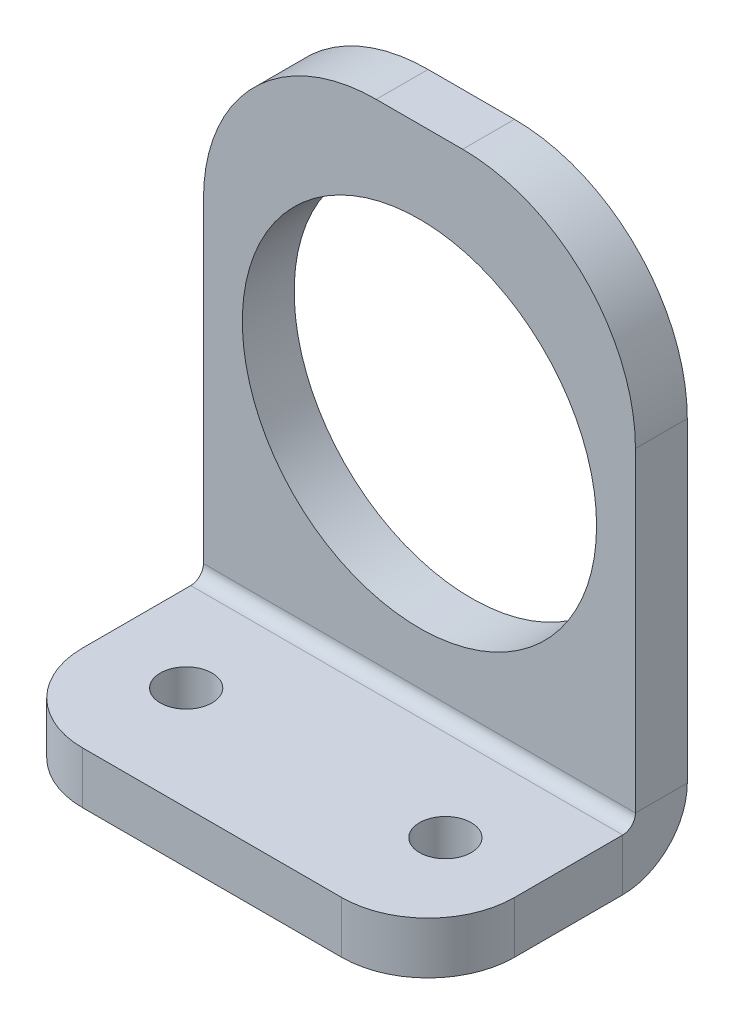
ISO-10303-21;
HEADER;
FILE_DESCRIPTION(('STEP AP214'),'2;1');
FILE_NAME('part.step','',(''),(''),'','','');
FILE_SCHEMA(('AUTOMOTIVE_DESIGN { 1 0 10303 214 1 1 1 1 }'));
ENDSEC;
DATA;
#1=APPLICATION_CONTEXT('core data for automotive mechanical design processes');
#2=APPLICATION_PROTOCOL_DEFINITION('international standard','automotive_design',2000,#1);
#3=PRODUCT_CONTEXT('',#1,'mechanical');
#4=PRODUCT('Part','Part','',(#3));
#5=PRODUCT_RELATED_PRODUCT_CATEGORY('part','',(#4));
#6=PRODUCT_DEFINITION_FORMATION('','',#4);
#7=PRODUCT_DEFINITION_CONTEXT('part definition',#1,'design');
#8=PRODUCT_DEFINITION('design','',#6,#7);
#9=PRODUCT_DEFINITION_SHAPE('','',#8);
#10=(LENGTH_UNIT() NAMED_UNIT(*) SI_UNIT(.MILLI.,.METRE.));
#11=(NAMED_UNIT(*) PLANE_ANGLE_UNIT() SI_UNIT($,.RADIAN.));
#12=(NAMED_UNIT(*) SI_UNIT($,.STERADIAN.) SOLID_ANGLE_UNIT());
#13=UNCERTAINTY_MEASURE_WITH_UNIT(LENGTH_MEASURE(1.E-05),#10,'distance_accuracy_value','');
#14=(GEOMETRIC_REPRESENTATION_CONTEXT(3) GLOBAL_UNCERTAINTY_ASSIGNED_CONTEXT((#13)) GLOBAL_UNIT_ASSIGNED_CONTEXT((#10,
#11,#12)) REPRESENTATION_CONTEXT('',''));
#15=CARTESIAN_POINT('',(0.,0.,0.));
#16=DIRECTION('',(0.,0.,1.));
#17=DIRECTION('',(1.,0.,0.));
#18=AXIS2_PLACEMENT_3D('',#15,#16,#17);
#19=CARTESIAN_POINT('',(12.5,-16.,-3.));
#20=DIRECTION('',(1.,0.,0.));
#21=DIRECTION('',(0.,0.,-1.));
#22=AXIS2_PLACEMENT_3D('',#19,#20,#21);
#23=PLANE('',#22);
#24=DIRECTION('',(0.,1.,0.));
#25=VECTOR('',#24,1.);
#26=CARTESIAN_POINT('',(12.5,-16.,-3.));
#27=LINE('',#26,#25);
#28=CARTESIAN_POINT('',(12.5,-12.2634,-3.));
#29=VERTEX_POINT('',#28);
#30=CARTESIAN_POINT('',(12.5,5.99999999999999,-3.));
#31=VERTEX_POINT('',#30);
#32=EDGE_CURVE('E220',#29,#31,#27,.T.);
#33=ORIENTED_EDGE('',*,*,#32,.T.);
#34=DIRECTION('',(0.,0.,1.));
#35=VECTOR('',#34,1.);
#36=CARTESIAN_POINT('',(12.5,5.99999999999999,-3.));
#37=LINE('',#36,#35);
#38=CARTESIAN_POINT('',(12.5,5.99999999999999,0.));
#39=VERTEX_POINT('',#38);
#40=EDGE_CURVE('E227',#31,#39,#37,.T.);
#41=ORIENTED_EDGE('',*,*,#40,.T.);
#42=DIRECTION('',(0.,1.,0.));
#43=VECTOR('',#42,1.);
#44=CARTESIAN_POINT('',(12.5,-16.,0.));
#45=LINE('',#44,#43);
#46=CARTESIAN_POINT('',(12.5,-12.2634,0.));
#47=VERTEX_POINT('',#46);
#48=EDGE_CURVE('E229',#47,#39,#45,.T.);
#49=ORIENTED_EDGE('',*,*,#48,.F.);
#50=DIRECTION('',(0.,0.,-1.));
#51=VECTOR('',#50,1.);
#52=CARTESIAN_POINT('',(12.5,-12.2634,0.));
#53=LINE('',#52,#51);
#54=EDGE_CURVE('E204',#47,#29,#53,.T.);
#55=ORIENTED_EDGE('',*,*,#54,.T.);
#56=EDGE_LOOP('',(#33,#41,#49,#55));
#57=FACE_BOUND('',#56,.T.);
#58=ADVANCED_FACE('F63',(#57),#23,.T.);
#59=CARTESIAN_POINT('',(0.,0.,-3.));
#60=DIRECTION('',(0.,0.,1.));
#61=DIRECTION('',(1.,0.,0.));
#62=AXIS2_PLACEMENT_3D('',#59,#60,#61);
#63=PLANE('',#62);
#64=CARTESIAN_POINT('',(0.,0.999999999999949,-3.));
#65=DIRECTION('',(0.,0.,1.));
#66=DIRECTION('',(1.,0.,0.));
#67=AXIS2_PLACEMENT_3D('',#64,#65,#66);
#68=CIRCLE('',#67,10.25);
#69=CARTESIAN_POINT('',(10.25,0.999999999999949,-3.));
#70=VERTEX_POINT('',#69);
#71=EDGE_CURVE('E201',#70,#70,#68,.T.);
#72=ORIENTED_EDGE('',*,*,#71,.T.);
#73=EDGE_LOOP('',(#72));
#74=FACE_BOUND('',#73,.T.);
#75=DIRECTION('',(-1.,0.,0.));
#76=VECTOR('',#75,1.);
#77=CARTESIAN_POINT('',(12.5,16.,-3.));
#78=LINE('',#77,#76);
#79=CARTESIAN_POINT('',(2.5,16.,-3.));
#80=VERTEX_POINT('',#79);
#81=CARTESIAN_POINT('',(-2.5,16.,-3.));
#82=VERTEX_POINT('',#81);
#83=EDGE_CURVE('E224',#80,#82,#78,.T.);
#84=ORIENTED_EDGE('',*,*,#83,.F.);
#85=CARTESIAN_POINT('',(2.5,5.99999999999999,-3.));
#86=DIRECTION('',(0.,0.,1.));
#87=DIRECTION('',(1.,0.,0.));
#88=AXIS2_PLACEMENT_3D('',#85,#86,#87);
#89=CIRCLE('',#88,10.);
#90=EDGE_CURVE('E247',#80,#31,#89,.F.);
#91=ORIENTED_EDGE('',*,*,#90,.T.);
#92=ORIENTED_EDGE('',*,*,#32,.F.);
#93=DIRECTION('',(1.,0.,0.));
#94=VECTOR('',#93,1.);
#95=CARTESIAN_POINT('',(12.5,-12.2634,-3.));
#96=LINE('',#95,#94);
#97=CARTESIAN_POINT('',(-12.5,-12.2634,-3.));
#98=VERTEX_POINT('',#97);
#99=EDGE_CURVE('E164',#29,#98,#96,.F.);
#100=ORIENTED_EDGE('',*,*,#99,.T.);
#101=DIRECTION('',(0.,-1.,0.));
#102=VECTOR('',#101,1.);
#103=CARTESIAN_POINT('',(-12.5,-16.,-3.));
#104=LINE('',#103,#102);
#105=CARTESIAN_POINT('',(-12.5,5.99999999999999,-3.));
#106=VERTEX_POINT('',#105);
#107=EDGE_CURVE('E218',#106,#98,#104,.T.);
#108=ORIENTED_EDGE('',*,*,#107,.F.);
#109=CARTESIAN_POINT('',(-2.5,5.99999999999999,-3.));
#110=DIRECTION('',(0.,0.,1.));
#111=DIRECTION('',(1.,0.,0.));
#112=AXIS2_PLACEMENT_3D('',#109,#110,#111);
#113=CIRCLE('',#112,10.);
#114=EDGE_CURVE('E245',#106,#82,#113,.F.);
#115=ORIENTED_EDGE('',*,*,#114,.T.);
#116=EDGE_LOOP('',(#84,#91,#92,#100,#108,#115));
#117=FACE_BOUND('',#116,.T.);
#118=ADVANCED_FACE('F292',(#74,#117),#63,.F.);
#119=CARTESIAN_POINT('',(0.,0.,0.));
#120=DIRECTION('',(0.,0.,1.));
#121=DIRECTION('',(1.,0.,0.));
#122=AXIS2_PLACEMENT_3D('',#119,#120,#121);
#123=PLANE('',#122);
#124=CARTESIAN_POINT('',(0.,0.999999999999949,0.));
#125=DIRECTION('',(0.,0.,1.));
#126=DIRECTION('',(1.,0.,0.));
#127=AXIS2_PLACEMENT_3D('',#124,#125,#126);
#128=CIRCLE('',#127,10.25);
#129=CARTESIAN_POINT('',(10.25,0.999999999999949,0.));
#130=VERTEX_POINT('',#129);
#131=EDGE_CURVE('E379',#130,#130,#128,.T.);
#132=ORIENTED_EDGE('',*,*,#131,.F.);
#133=EDGE_LOOP('',(#132));
#134=FACE_BOUND('',#133,.T.);
#135=ORIENTED_EDGE('',*,*,#48,.T.);
#136=CARTESIAN_POINT('',(2.5,5.99999999999999,0.));
#137=DIRECTION('',(0.,0.,1.));
#138=DIRECTION('',(1.,0.,0.));
#139=AXIS2_PLACEMENT_3D('',#136,#137,#138);
#140=CIRCLE('',#139,10.);
#141=CARTESIAN_POINT('',(2.5,16.,0.));
#142=VERTEX_POINT('',#141);
#143=EDGE_CURVE('E238',#39,#142,#140,.T.);
#144=ORIENTED_EDGE('',*,*,#143,.T.);
#145=DIRECTION('',(-1.,0.,0.));
#146=VECTOR('',#145,1.);
#147=CARTESIAN_POINT('',(12.5,16.,0.));
#148=LINE('',#147,#146);
#149=CARTESIAN_POINT('',(-2.5,16.,0.));
#150=VERTEX_POINT('',#149);
#151=EDGE_CURVE('E221',#142,#150,#148,.T.);
#152=ORIENTED_EDGE('',*,*,#151,.T.);
#153=CARTESIAN_POINT('',(-2.5,5.99999999999999,0.));
#154=DIRECTION('',(0.,0.,1.));
#155=DIRECTION('',(1.,0.,0.));
#156=AXIS2_PLACEMENT_3D('',#153,#154,#155);
#157=CIRCLE('',#156,10.);
#158=CARTESIAN_POINT('',(-12.5,5.99999999999999,0.));
#159=VERTEX_POINT('',#158);
#160=EDGE_CURVE('E236',#150,#159,#157,.T.);
#161=ORIENTED_EDGE('',*,*,#160,.T.);
#162=DIRECTION('',(0.,-1.,0.));
#163=VECTOR('',#162,1.);
#164=CARTESIAN_POINT('',(-12.5,-16.,0.));
#165=LINE('',#164,#163);
#166=CARTESIAN_POINT('',(-12.5,-12.2634,0.));
#167=VERTEX_POINT('',#166);
#168=EDGE_CURVE('E215',#159,#167,#165,.T.);
#169=ORIENTED_EDGE('',*,*,#168,.T.);
#170=DIRECTION('',(1.,0.,0.));
#171=VECTOR('',#170,1.);
#172=CARTESIAN_POINT('',(12.5,-12.2634,0.));
#173=LINE('',#172,#171);
#174=EDGE_CURVE('E208',#47,#167,#173,.F.);
#175=ORIENTED_EDGE('',*,*,#174,.F.);
#176=EDGE_LOOP('',(#135,#144,#152,#161,#169,#175));
#177=FACE_BOUND('',#176,.T.);
#178=ADVANCED_FACE('F298',(#134,#177),#123,.T.);
#179=CARTESIAN_POINT('',(-12.5,-16.,-3.));
#180=DIRECTION('',(-1.,0.,0.));
#181=DIRECTION('',(0.,0.,1.));
#182=AXIS2_PLACEMENT_3D('',#179,#180,#181);
#183=PLANE('',#182);
#184=ORIENTED_EDGE('',*,*,#168,.F.);
#185=DIRECTION('',(0.,0.,1.));
#186=VECTOR('',#185,1.);
#187=CARTESIAN_POINT('',(-12.5,5.99999999999999,-3.));
#188=LINE('',#187,#186);
#189=EDGE_CURVE('E249',#159,#106,#188,.F.);
#190=ORIENTED_EDGE('',*,*,#189,.T.);
#191=ORIENTED_EDGE('',*,*,#107,.T.);
#192=DIRECTION('',(0.,0.,-1.));
#193=VECTOR('',#192,1.);
#194=CARTESIAN_POINT('',(-12.5,-12.2634,0.));
#195=LINE('',#194,#193);
#196=EDGE_CURVE('E212',#167,#98,#195,.T.);
#197=ORIENTED_EDGE('',*,*,#196,.F.);
#198=EDGE_LOOP('',(#184,#190,#191,#197));
#199=FACE_BOUND('',#198,.T.);
#200=ADVANCED_FACE('F286',(#199),#183,.T.);
#201=CARTESIAN_POINT('',(12.5,16.,-3.));
#202=DIRECTION('',(0.,1.,0.));
#203=DIRECTION('',(0.,0.,1.));
#204=AXIS2_PLACEMENT_3D('',#201,#202,#203);
#205=PLANE('',#204);
#206=ORIENTED_EDGE('',*,*,#151,.F.);
#207=DIRECTION('',(0.,0.,1.));
#208=VECTOR('',#207,1.);
#209=CARTESIAN_POINT('',(2.5,16.,-3.));
#210=LINE('',#209,#208);
#211=EDGE_CURVE('E243',#142,#80,#210,.F.);
#212=ORIENTED_EDGE('',*,*,#211,.T.);
#213=ORIENTED_EDGE('',*,*,#83,.T.);
#214=DIRECTION('',(0.,0.,1.));
#215=VECTOR('',#214,1.);
#216=CARTESIAN_POINT('',(-2.5,16.,-3.));
#217=LINE('',#216,#215);
#218=EDGE_CURVE('E240',#82,#150,#217,.T.);
#219=ORIENTED_EDGE('',*,*,#218,.T.);
#220=EDGE_LOOP('',(#206,#212,#213,#219));
#221=FACE_BOUND('',#220,.T.);
#222=ADVANCED_FACE('F304',(#221),#205,.T.);
#223=CARTESIAN_POINT('',(-12.5,-12.2634,0.7366));
#224=DIRECTION('',(-1.,0.,0.));
#225=DIRECTION('',(0.,0.,1.));
#226=AXIS2_PLACEMENT_3D('',#223,#224,#225);
#227=PLANE('',#226);
#228=DIRECTION('',(0.,1.,0.));
#229=VECTOR('',#228,1.);
#230=CARTESIAN_POINT('',(-12.5,-16.,0.736599999999986));
#231=LINE('',#230,#229);
#232=CARTESIAN_POINT('',(-12.5,-13.,0.736599999999997));
#233=VERTEX_POINT('',#232);
#234=CARTESIAN_POINT('',(-12.5,-16.,0.736599999999986));
#235=VERTEX_POINT('',#234);
#236=EDGE_CURVE('E198',#233,#235,#231,.F.);
#237=ORIENTED_EDGE('',*,*,#236,.F.);
#238=CARTESIAN_POINT('',(-12.5,-12.2634,0.7366));
#239=DIRECTION('',(1.,0.,0.));
#240=DIRECTION('',(0.,0.,-1.));
#241=AXIS2_PLACEMENT_3D('',#238,#239,#240);
#242=CIRCLE('',#241,0.7366);
#243=EDGE_CURVE('E167',#167,#233,#242,.F.);
#244=ORIENTED_EDGE('',*,*,#243,.F.);
#245=ORIENTED_EDGE('',*,*,#196,.T.);
#246=CARTESIAN_POINT('',(-12.5,-12.2634,0.7366));
#247=DIRECTION('',(1.,0.,0.));
#248=DIRECTION('',(0.,0.,-1.));
#249=AXIS2_PLACEMENT_3D('',#246,#247,#248);
#250=CIRCLE('',#249,3.7366);
#251=EDGE_CURVE('E203',#98,#235,#250,.F.);
#252=ORIENTED_EDGE('',*,*,#251,.T.);
#253=EDGE_LOOP('',(#237,#244,#245,#252));
#254=FACE_BOUND('',#253,.T.);
#255=ADVANCED_FACE('F282',(#254),#227,.T.);
#256=CARTESIAN_POINT('',(12.5,-12.2634,0.7366));
#257=DIRECTION('',(-1.,0.,0.));
#258=DIRECTION('',(0.,0.,1.));
#259=AXIS2_PLACEMENT_3D('',#256,#257,#258);
#260=PLANE('',#259);
#261=CARTESIAN_POINT('',(12.5,-12.2634,0.7366));
#262=DIRECTION('',(1.,0.,0.));
#263=DIRECTION('',(0.,0.,-1.));
#264=AXIS2_PLACEMENT_3D('',#261,#262,#263);
#265=CIRCLE('',#264,0.7366);
#266=CARTESIAN_POINT('',(12.5,-13.,0.736599999999997));
#267=VERTEX_POINT('',#266);
#268=EDGE_CURVE('E174',#267,#47,#265,.T.);
#269=ORIENTED_EDGE('',*,*,#268,.F.);
#270=DIRECTION('',(0.,1.,0.));
#271=VECTOR('',#270,1.);
#272=CARTESIAN_POINT('',(12.5,-13.,0.736599999999997));
#273=LINE('',#272,#271);
#274=CARTESIAN_POINT('',(12.5,-16.,0.736599999999986));
#275=VERTEX_POINT('',#274);
#276=EDGE_CURVE('E171',#267,#275,#273,.F.);
#277=ORIENTED_EDGE('',*,*,#276,.T.);
#278=CARTESIAN_POINT('',(12.5,-12.2634,0.7366));
#279=DIRECTION('',(1.,0.,0.));
#280=DIRECTION('',(0.,0.,-1.));
#281=AXIS2_PLACEMENT_3D('',#278,#279,#280);
#282=CIRCLE('',#281,3.7366);
#283=EDGE_CURVE('E156',#275,#29,#282,.T.);
#284=ORIENTED_EDGE('',*,*,#283,.T.);
#285=ORIENTED_EDGE('',*,*,#54,.F.);
#286=EDGE_LOOP('',(#269,#277,#284,#285));
#287=FACE_BOUND('',#286,.T.);
#288=ADVANCED_FACE('F172',(#287),#260,.F.);
#289=CARTESIAN_POINT('',(12.5,-12.2634,0.7366));
#290=DIRECTION('',(1.,0.,0.));
#291=DIRECTION('',(0.,-1.,0.));
#292=AXIS2_PLACEMENT_3D('',#289,#290,#291);
#293=CYLINDRICAL_SURFACE('',#292,3.7366);
#294=ORIENTED_EDGE('',*,*,#99,.F.);
#295=ORIENTED_EDGE('',*,*,#283,.F.);
#296=DIRECTION('',(1.,0.,0.));
#297=VECTOR('',#296,1.);
#298=CARTESIAN_POINT('',(-12.5,-16.,0.736599999999986));
#299=LINE('',#298,#297);
#300=EDGE_CURVE('E161',#275,#235,#299,.F.);
#301=ORIENTED_EDGE('',*,*,#300,.T.);
#302=ORIENTED_EDGE('',*,*,#251,.F.);
#303=EDGE_LOOP('',(#294,#295,#301,#302));
#304=FACE_BOUND('',#303,.T.);
#305=ADVANCED_FACE('F158',(#304),#293,.T.);
#306=CARTESIAN_POINT('',(12.5,-12.2634,0.7366));
#307=DIRECTION('',(1.,0.,0.));
#308=DIRECTION('',(0.,-1.,0.));
#309=AXIS2_PLACEMENT_3D('',#306,#307,#308);
#310=CYLINDRICAL_SURFACE('',#309,0.7366);
#311=ORIENTED_EDGE('',*,*,#174,.T.);
#312=ORIENTED_EDGE('',*,*,#243,.T.);
#313=DIRECTION('',(1.,0.,0.));
#314=VECTOR('',#313,1.);
#315=CARTESIAN_POINT('',(-12.5,-13.,0.736599999999997));
#316=LINE('',#315,#314);
#317=EDGE_CURVE('E176',#233,#267,#316,.T.);
#318=ORIENTED_EDGE('',*,*,#317,.T.);
#319=ORIENTED_EDGE('',*,*,#268,.T.);
#320=EDGE_LOOP('',(#311,#312,#318,#319));
#321=FACE_BOUND('',#320,.T.);
#322=ADVANCED_FACE('F279',(#321),#310,.F.);
#323=CARTESIAN_POINT('',(-12.5,-16.,0.));
#324=DIRECTION('',(1.,0.,0.));
#325=DIRECTION('',(0.,0.,-1.));
#326=AXIS2_PLACEMENT_3D('',#323,#324,#325);
#327=PLANE('',#326);
#328=DIRECTION('',(0.,0.,-1.));
#329=VECTOR('',#328,1.);
#330=CARTESIAN_POINT('',(-12.5,-16.,0.));
#331=LINE('',#330,#329);
#332=CARTESIAN_POINT('',(-12.5,-16.,7.));
#333=VERTEX_POINT('',#332);
#334=EDGE_CURVE('E181',#333,#235,#331,.T.);
#335=ORIENTED_EDGE('',*,*,#334,.F.);
#336=DIRECTION('',(0.,1.,0.));
#337=VECTOR('',#336,1.);
#338=CARTESIAN_POINT('',(-12.5,-16.,7.));
#339=LINE('',#338,#337);
#340=CARTESIAN_POINT('',(-12.5,-13.,7.00000000000001));
#341=VERTEX_POINT('',#340);
#342=EDGE_CURVE('E13',#333,#341,#339,.T.);
#343=ORIENTED_EDGE('',*,*,#342,.T.);
#344=DIRECTION('',(0.,0.,1.));
#345=VECTOR('',#344,1.);
#346=CARTESIAN_POINT('',(-12.5,-13.,0.));
#347=LINE('',#346,#345);
#348=EDGE_CURVE('E182',#341,#233,#347,.F.);
#349=ORIENTED_EDGE('',*,*,#348,.T.);
#350=ORIENTED_EDGE('',*,*,#236,.T.);
#351=EDGE_LOOP('',(#335,#343,#349,#350));
#352=FACE_BOUND('',#351,.T.);
#353=ADVANCED_FACE('F276',(#352),#327,.F.);
#354=CARTESIAN_POINT('',(12.5,-16.,12.));
#355=DIRECTION('',(-1.,0.,0.));
#356=DIRECTION('',(0.,0.,1.));
#357=AXIS2_PLACEMENT_3D('',#354,#355,#356);
#358=PLANE('',#357);
#359=DIRECTION('',(0.,0.,-1.));
#360=VECTOR('',#359,1.);
#361=CARTESIAN_POINT('',(12.5,-13.,12.));
#362=LINE('',#361,#360);
#363=CARTESIAN_POINT('',(12.5,-13.,7.00000000000001));
#364=VERTEX_POINT('',#363);
#365=EDGE_CURVE('E194',#267,#364,#362,.F.);
#366=ORIENTED_EDGE('',*,*,#365,.T.);
#367=DIRECTION('',(0.,1.,0.));
#368=VECTOR('',#367,1.);
#369=CARTESIAN_POINT('',(12.5,-16.,7.));
#370=LINE('',#369,#368);
#371=CARTESIAN_POINT('',(12.5,-16.,7.));
#372=VERTEX_POINT('',#371);
#373=EDGE_CURVE('E86',#364,#372,#370,.F.);
#374=ORIENTED_EDGE('',*,*,#373,.T.);
#375=DIRECTION('',(0.,0.,1.));
#376=VECTOR('',#375,1.);
#377=CARTESIAN_POINT('',(12.5,-16.,0.));
#378=LINE('',#377,#376);
#379=EDGE_CURVE('E179',#275,#372,#378,.T.);
#380=ORIENTED_EDGE('',*,*,#379,.F.);
#381=ORIENTED_EDGE('',*,*,#276,.F.);
#382=EDGE_LOOP('',(#366,#374,#380,#381));
#383=FACE_BOUND('',#382,.T.);
#384=ADVANCED_FACE('F184',(#383),#358,.F.);
#385=CARTESIAN_POINT('',(0.,-16.,0.));
#386=DIRECTION('',(0.,1.,0.));
#387=DIRECTION('',(0.,0.,1.));
#388=AXIS2_PLACEMENT_3D('',#385,#386,#387);
#389=PLANE('',#388);
#390=CARTESIAN_POINT('',(-7.5,-16.,6.));
#391=DIRECTION('',(0.,1.,0.));
#392=DIRECTION('',(0.,0.,1.));
#393=AXIS2_PLACEMENT_3D('',#390,#391,#392);
#394=CIRCLE('',#393,1.5);
#395=CARTESIAN_POINT('',(-7.5,-16.,7.5));
#396=VERTEX_POINT('',#395);
#397=EDGE_CURVE('E375',#396,#396,#394,.T.);
#398=ORIENTED_EDGE('',*,*,#397,.T.);
#399=EDGE_LOOP('',(#398));
#400=FACE_BOUND('',#399,.T.);
#401=CARTESIAN_POINT('',(7.5,-16.,6.));
#402=DIRECTION('',(0.,1.,0.));
#403=DIRECTION('',(0.,0.,1.));
#404=AXIS2_PLACEMENT_3D('',#401,#402,#403);
#405=CIRCLE('',#404,1.5);
#406=CARTESIAN_POINT('',(7.5,-16.,7.5));
#407=VERTEX_POINT('',#406);
#408=EDGE_CURVE('E373',#407,#407,#405,.T.);
#409=ORIENTED_EDGE('',*,*,#408,.T.);
#410=EDGE_LOOP('',(#409));
#411=FACE_BOUND('',#410,.T.);
#412=ORIENTED_EDGE('',*,*,#379,.T.);
#413=CARTESIAN_POINT('',(7.5,-16.,7.));
#414=DIRECTION('',(0.,1.,0.));
#415=DIRECTION('',(0.,0.,1.));
#416=AXIS2_PLACEMENT_3D('',#413,#414,#415);
#417=CIRCLE('',#416,5.);
#418=CARTESIAN_POINT('',(7.5,-16.,12.));
#419=VERTEX_POINT('',#418);
#420=EDGE_CURVE('E71',#372,#419,#417,.F.);
#421=ORIENTED_EDGE('',*,*,#420,.T.);
#422=DIRECTION('',(-1.,0.,0.));
#423=VECTOR('',#422,1.);
#424=CARTESIAN_POINT('',(0.,-16.,12.));
#425=LINE('',#424,#423);
#426=CARTESIAN_POINT('',(-7.5,-16.,12.));
#427=VERTEX_POINT('',#426);
#428=EDGE_CURVE('E185',#419,#427,#425,.T.);
#429=ORIENTED_EDGE('',*,*,#428,.T.);
#430=CARTESIAN_POINT('',(-7.5,-16.,7.));
#431=DIRECTION('',(0.,1.,0.));
#432=DIRECTION('',(0.,0.,1.));
#433=AXIS2_PLACEMENT_3D('',#430,#431,#432);
#434=CIRCLE('',#433,5.);
#435=EDGE_CURVE('E78',#427,#333,#434,.F.);
#436=ORIENTED_EDGE('',*,*,#435,.T.);
#437=ORIENTED_EDGE('',*,*,#334,.T.);
#438=ORIENTED_EDGE('',*,*,#300,.F.);
#439=EDGE_LOOP('',(#412,#421,#429,#436,#437,#438));
#440=FACE_BOUND('',#439,.T.);
#441=ADVANCED_FACE('F178',(#400,#411,#440),#389,.F.);
#442=CARTESIAN_POINT('',(0.,-13.,0.));
#443=DIRECTION('',(0.,1.,0.));
#444=DIRECTION('',(0.,0.,1.));
#445=AXIS2_PLACEMENT_3D('',#442,#443,#444);
#446=PLANE('',#445);
#447=CARTESIAN_POINT('',(-7.5,-13.,6.00000000000001));
#448=DIRECTION('',(0.,1.,0.));
#449=DIRECTION('',(0.,0.,1.));
#450=AXIS2_PLACEMENT_3D('',#447,#448,#449);
#451=CIRCLE('',#450,1.5);
#452=CARTESIAN_POINT('',(-7.5,-13.,7.50000000000001));
#453=VERTEX_POINT('',#452);
#454=EDGE_CURVE('E376',#453,#453,#451,.T.);
#455=ORIENTED_EDGE('',*,*,#454,.F.);
#456=EDGE_LOOP('',(#455));
#457=FACE_BOUND('',#456,.T.);
#458=CARTESIAN_POINT('',(7.5,-13.,6.00000000000001));
#459=DIRECTION('',(0.,1.,0.));
#460=DIRECTION('',(0.,0.,-1.));
#461=AXIS2_PLACEMENT_3D('',#458,#459,#460);
#462=CIRCLE('',#461,1.5);
#463=CARTESIAN_POINT('',(7.5,-13.,4.50000000000001));
#464=VERTEX_POINT('',#463);
#465=EDGE_CURVE('E370',#464,#464,#462,.T.);
#466=ORIENTED_EDGE('',*,*,#465,.F.);
#467=EDGE_LOOP('',(#466));
#468=FACE_BOUND('',#467,.T.);
#469=DIRECTION('',(1.,0.,0.));
#470=VECTOR('',#469,1.);
#471=CARTESIAN_POINT('',(-12.5,-13.,12.));
#472=LINE('',#471,#470);
#473=CARTESIAN_POINT('',(7.5,-13.,12.));
#474=VERTEX_POINT('',#473);
#475=CARTESIAN_POINT('',(-7.5,-13.,12.));
#476=VERTEX_POINT('',#475);
#477=EDGE_CURVE('E188',#474,#476,#472,.F.);
#478=ORIENTED_EDGE('',*,*,#477,.F.);
#479=CARTESIAN_POINT('',(7.5,-13.,7.00000000000001));
#480=DIRECTION('',(0.,1.,0.));
#481=DIRECTION('',(0.,0.,1.));
#482=AXIS2_PLACEMENT_3D('',#479,#480,#481);
#483=CIRCLE('',#482,5.);
#484=EDGE_CURVE('E258',#474,#364,#483,.T.);
#485=ORIENTED_EDGE('',*,*,#484,.T.);
#486=ORIENTED_EDGE('',*,*,#365,.F.);
#487=ORIENTED_EDGE('',*,*,#317,.F.);
#488=ORIENTED_EDGE('',*,*,#348,.F.);
#489=CARTESIAN_POINT('',(-7.5,-13.,7.00000000000001));
#490=DIRECTION('',(0.,1.,0.));
#491=DIRECTION('',(0.,0.,1.));
#492=AXIS2_PLACEMENT_3D('',#489,#490,#491);
#493=CIRCLE('',#492,5.);
#494=EDGE_CURVE('E256',#341,#476,#493,.T.);
#495=ORIENTED_EDGE('',*,*,#494,.T.);
#496=EDGE_LOOP('',(#478,#485,#486,#487,#488,#495));
#497=FACE_BOUND('',#496,.T.);
#498=ADVANCED_FACE('F270',(#457,#468,#497),#446,.T.);
#499=CARTESIAN_POINT('',(-12.5,-16.,12.));
#500=DIRECTION('',(0.,0.,-1.));
#501=DIRECTION('',(0.,1.,0.));
#502=AXIS2_PLACEMENT_3D('',#499,#500,#501);
#503=PLANE('',#502);
#504=ORIENTED_EDGE('',*,*,#428,.F.);
#505=DIRECTION('',(0.,1.,0.));
#506=VECTOR('',#505,1.);
#507=CARTESIAN_POINT('',(7.5,-16.,12.));
#508=LINE('',#507,#506);
#509=EDGE_CURVE('E253',#419,#474,#508,.T.);
#510=ORIENTED_EDGE('',*,*,#509,.T.);
#511=ORIENTED_EDGE('',*,*,#477,.T.);
#512=DIRECTION('',(0.,1.,0.));
#513=VECTOR('',#512,1.);
#514=CARTESIAN_POINT('',(-7.5,-16.,12.));
#515=LINE('',#514,#513);
#516=EDGE_CURVE('E251',#476,#427,#515,.F.);
#517=ORIENTED_EDGE('',*,*,#516,.T.);
#518=EDGE_LOOP('',(#504,#510,#511,#517));
#519=FACE_BOUND('',#518,.T.);
#520=ADVANCED_FACE('F265',(#519),#503,.F.);
#521=CARTESIAN_POINT('',(0.,0.999999999999949,-10.));
#522=DIRECTION('',(0.,0.,1.));
#523=DIRECTION('',(1.,0.,0.));
#524=AXIS2_PLACEMENT_3D('',#521,#522,#523);
#525=CYLINDRICAL_SURFACE('',#524,10.25);
#526=ORIENTED_EDGE('',*,*,#131,.T.);
#527=EDGE_LOOP('',(#526));
#528=FACE_BOUND('',#527,.T.);
#529=ORIENTED_EDGE('',*,*,#71,.F.);
#530=EDGE_LOOP('',(#529));
#531=FACE_BOUND('',#530,.T.);
#532=ADVANCED_FACE('F353',(#528,#531),#525,.F.);
#533=CARTESIAN_POINT('',(7.5,-23.,5.99999999999997));
#534=DIRECTION('',(0.,1.,0.));
#535=DIRECTION('',(0.,0.,1.));
#536=AXIS2_PLACEMENT_3D('',#533,#534,#535);
#537=CYLINDRICAL_SURFACE('',#536,1.5);
#538=ORIENTED_EDGE('',*,*,#465,.T.);
#539=EDGE_LOOP('',(#538));
#540=FACE_BOUND('',#539,.T.);
#541=ORIENTED_EDGE('',*,*,#408,.F.);
#542=EDGE_LOOP('',(#541));
#543=FACE_BOUND('',#542,.T.);
#544=ADVANCED_FACE('F316',(#540,#543),#537,.F.);
#545=CARTESIAN_POINT('',(-7.5,-23.,5.99999999999998));
#546=DIRECTION('',(0.,1.,0.));
#547=DIRECTION('',(0.,0.,1.));
#548=AXIS2_PLACEMENT_3D('',#545,#546,#547);
#549=CYLINDRICAL_SURFACE('',#548,1.5);
#550=ORIENTED_EDGE('',*,*,#454,.T.);
#551=EDGE_LOOP('',(#550));
#552=FACE_BOUND('',#551,.T.);
#553=ORIENTED_EDGE('',*,*,#397,.F.);
#554=EDGE_LOOP('',(#553));
#555=FACE_BOUND('',#554,.T.);
#556=ADVANCED_FACE('F309',(#552,#555),#549,.F.);
#557=CARTESIAN_POINT('',(2.5,5.99999999999999,-3.));
#558=DIRECTION('',(0.,0.,1.));
#559=DIRECTION('',(1.,0.,0.));
#560=AXIS2_PLACEMENT_3D('',#557,#558,#559);
#561=CYLINDRICAL_SURFACE('',#560,10.);
#562=ORIENTED_EDGE('',*,*,#90,.F.);
#563=ORIENTED_EDGE('',*,*,#211,.F.);
#564=ORIENTED_EDGE('',*,*,#143,.F.);
#565=ORIENTED_EDGE('',*,*,#40,.F.);
#566=EDGE_LOOP('',(#562,#563,#564,#565));
#567=FACE_BOUND('',#566,.T.);
#568=ADVANCED_FACE('F307',(#567),#561,.T.);
#569=CARTESIAN_POINT('',(-2.5,5.99999999999999,-3.));
#570=DIRECTION('',(0.,0.,1.));
#571=DIRECTION('',(1.,0.,0.));
#572=AXIS2_PLACEMENT_3D('',#569,#570,#571);
#573=CYLINDRICAL_SURFACE('',#572,10.);
#574=ORIENTED_EDGE('',*,*,#114,.F.);
#575=ORIENTED_EDGE('',*,*,#189,.F.);
#576=ORIENTED_EDGE('',*,*,#160,.F.);
#577=ORIENTED_EDGE('',*,*,#218,.F.);
#578=EDGE_LOOP('',(#574,#575,#576,#577));
#579=FACE_BOUND('',#578,.T.);
#580=ADVANCED_FACE('F302',(#579),#573,.T.);
#581=CARTESIAN_POINT('',(7.5,-16.,7.));
#582=DIRECTION('',(0.,1.,0.));
#583=DIRECTION('',(0.,0.,1.));
#584=AXIS2_PLACEMENT_3D('',#581,#582,#583);
#585=CYLINDRICAL_SURFACE('',#584,5.);
#586=ORIENTED_EDGE('',*,*,#420,.F.);
#587=ORIENTED_EDGE('',*,*,#373,.F.);
#588=ORIENTED_EDGE('',*,*,#484,.F.);
#589=ORIENTED_EDGE('',*,*,#509,.F.);
#590=EDGE_LOOP('',(#586,#587,#588,#589));
#591=FACE_BOUND('',#590,.T.);
#592=ADVANCED_FACE('F268',(#591),#585,.T.);
#593=CARTESIAN_POINT('',(-7.5,-16.,7.));
#594=DIRECTION('',(0.,1.,0.));
#595=DIRECTION('',(0.,0.,1.));
#596=AXIS2_PLACEMENT_3D('',#593,#594,#595);
#597=CYLINDRICAL_SURFACE('',#596,5.);
#598=ORIENTED_EDGE('',*,*,#435,.F.);
#599=ORIENTED_EDGE('',*,*,#516,.F.);
#600=ORIENTED_EDGE('',*,*,#494,.F.);
#601=ORIENTED_EDGE('',*,*,#342,.F.);
#602=EDGE_LOOP('',(#598,#599,#600,#601));
#603=FACE_BOUND('',#602,.T.);
#604=ADVANCED_FACE('F65',(#603),#597,.T.);
#605=CLOSED_SHELL('',(#58,#118,#178,#200,#222,#255,#288,#305,#322,#353,#384,#441,#498,#520,#532,
#544,#556,#568,#580,#592,#604));
#606=MANIFOLD_SOLID_BREP('B2',#605);
#607=ADVANCED_BREP_SHAPE_REPRESENTATION('',(#18,#606),#14);
#608=SHAPE_DEFINITION_REPRESENTATION(#9,#607);
ENDSEC;
END-ISO-10303-21;
